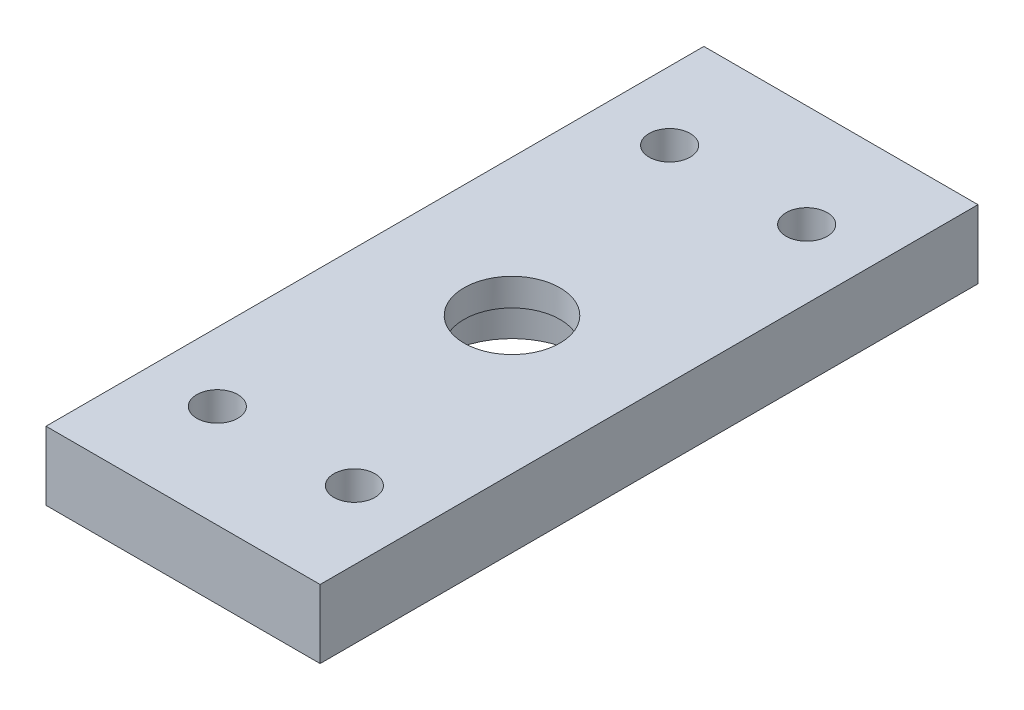
ISO-10303-21;
HEADER;
FILE_DESCRIPTION(('STEP AP214'),'2;1');
FILE_NAME('part.step','',(''),(''),'','','');
FILE_SCHEMA(('AUTOMOTIVE_DESIGN { 1 0 10303 214 1 1 1 1 }'));
ENDSEC;
DATA;
#1=APPLICATION_CONTEXT('core data for automotive mechanical design processes');
#2=APPLICATION_PROTOCOL_DEFINITION('international standard','automotive_design',2000,#1);
#3=PRODUCT_CONTEXT('',#1,'mechanical');
#4=PRODUCT('Part','Part','',(#3));
#5=PRODUCT_RELATED_PRODUCT_CATEGORY('part','',(#4));
#6=PRODUCT_DEFINITION_FORMATION('','',#4);
#7=PRODUCT_DEFINITION_CONTEXT('part definition',#1,'design');
#8=PRODUCT_DEFINITION('design','',#6,#7);
#9=PRODUCT_DEFINITION_SHAPE('','',#8);
#10=(LENGTH_UNIT() NAMED_UNIT(*) SI_UNIT(.MILLI.,.METRE.));
#11=(NAMED_UNIT(*) PLANE_ANGLE_UNIT() SI_UNIT($,.RADIAN.));
#12=(NAMED_UNIT(*) SI_UNIT($,.STERADIAN.) SOLID_ANGLE_UNIT());
#13=UNCERTAINTY_MEASURE_WITH_UNIT(LENGTH_MEASURE(1.E-05),#10,'distance_accuracy_value','');
#14=(GEOMETRIC_REPRESENTATION_CONTEXT(3) GLOBAL_UNCERTAINTY_ASSIGNED_CONTEXT((#13)) GLOBAL_UNIT_ASSIGNED_CONTEXT((#10,
#11,#12)) REPRESENTATION_CONTEXT('',''));
#15=CARTESIAN_POINT('',(0.,0.,0.));
#16=DIRECTION('',(0.,0.,1.));
#17=DIRECTION('',(1.,0.,0.));
#18=AXIS2_PLACEMENT_3D('',#15,#16,#17);
#19=CARTESIAN_POINT('',(0.,0.,0.));
#20=DIRECTION('',(0.,1.,0.));
#21=DIRECTION('',(0.,0.,1.));
#22=AXIS2_PLACEMENT_3D('',#19,#20,#21);
#23=CYLINDRICAL_SURFACE('',#22,3.5);
#24=CARTESIAN_POINT('',(0.,5.,0.));
#25=DIRECTION('',(0.,1.,0.));
#26=DIRECTION('',(0.,0.,1.));
#27=AXIS2_PLACEMENT_3D('',#24,#25,#26);
#28=CIRCLE('',#27,3.5);
#29=CARTESIAN_POINT('',(0.,5.,3.5));
#30=VERTEX_POINT('',#29);
#31=EDGE_CURVE('E105',#30,#30,#28,.T.);
#32=ORIENTED_EDGE('',*,*,#31,.T.);
#33=EDGE_LOOP('',(#32));
#34=FACE_BOUND('',#33,.T.);
#35=CARTESIAN_POINT('',(0.,3.,0.));
#36=DIRECTION('',(0.,-1.,0.));
#37=DIRECTION('',(0.,0.,-1.));
#38=AXIS2_PLACEMENT_3D('',#35,#36,#37);
#39=CIRCLE('',#38,3.5);
#40=CARTESIAN_POINT('',(0.,3.,-3.5));
#41=VERTEX_POINT('',#40);
#42=EDGE_CURVE('E40',#41,#41,#39,.F.);
#43=ORIENTED_EDGE('',*,*,#42,.F.);
#44=EDGE_LOOP('',(#43));
#45=FACE_BOUND('',#44,.T.);
#46=ADVANCED_FACE('F36',(#34,#45),#23,.F.);
#47=CARTESIAN_POINT('',(9.99999999999999,5.,-24.));
#48=DIRECTION('',(-1.,0.,0.));
#49=DIRECTION('',(0.,0.,1.));
#50=AXIS2_PLACEMENT_3D('',#47,#48,#49);
#51=PLANE('',#50);
#52=DIRECTION('',(0.,0.,-1.));
#53=VECTOR('',#52,1.);
#54=CARTESIAN_POINT('',(9.99999999999999,0.,-24.));
#55=LINE('',#54,#53);
#56=CARTESIAN_POINT('',(10.,0.,24.));
#57=VERTEX_POINT('',#56);
#58=CARTESIAN_POINT('',(9.99999999999999,0.,-24.));
#59=VERTEX_POINT('',#58);
#60=EDGE_CURVE('E102',#57,#59,#55,.T.);
#61=ORIENTED_EDGE('',*,*,#60,.T.);
#62=DIRECTION('',(0.,-1.,0.));
#63=VECTOR('',#62,1.);
#64=CARTESIAN_POINT('',(9.99999999999999,5.,-24.));
#65=LINE('',#64,#63);
#66=CARTESIAN_POINT('',(9.99999999999999,5.,-24.));
#67=VERTEX_POINT('',#66);
#68=EDGE_CURVE('E11',#67,#59,#65,.T.);
#69=ORIENTED_EDGE('',*,*,#68,.F.);
#70=DIRECTION('',(0.,0.,-1.));
#71=VECTOR('',#70,1.);
#72=CARTESIAN_POINT('',(9.99999999999999,5.,-24.));
#73=LINE('',#72,#71);
#74=CARTESIAN_POINT('',(10.,5.,24.));
#75=VERTEX_POINT('',#74);
#76=EDGE_CURVE('E89',#75,#67,#73,.T.);
#77=ORIENTED_EDGE('',*,*,#76,.F.);
#78=DIRECTION('',(0.,-1.,0.));
#79=VECTOR('',#78,1.);
#80=CARTESIAN_POINT('',(10.,5.,24.));
#81=LINE('',#80,#79);
#82=EDGE_CURVE('E98',#75,#57,#81,.T.);
#83=ORIENTED_EDGE('',*,*,#82,.T.);
#84=EDGE_LOOP('',(#61,#69,#77,#83));
#85=FACE_BOUND('',#84,.T.);
#86=ADVANCED_FACE('F38',(#85),#51,.F.);
#87=CARTESIAN_POINT('',(-10.,5.,-24.));
#88=DIRECTION('',(0.,0.,1.));
#89=DIRECTION('',(1.,0.,0.));
#90=AXIS2_PLACEMENT_3D('',#87,#88,#89);
#91=PLANE('',#90);
#92=DIRECTION('',(-1.,0.,0.));
#93=VECTOR('',#92,1.);
#94=CARTESIAN_POINT('',(-10.,0.,-24.));
#95=LINE('',#94,#93);
#96=CARTESIAN_POINT('',(-10.,0.,-24.));
#97=VERTEX_POINT('',#96);
#98=EDGE_CURVE('E93',#59,#97,#95,.T.);
#99=ORIENTED_EDGE('',*,*,#98,.T.);
#100=DIRECTION('',(0.,-1.,0.));
#101=VECTOR('',#100,1.);
#102=CARTESIAN_POINT('',(-10.,5.,-24.));
#103=LINE('',#102,#101);
#104=CARTESIAN_POINT('',(-10.,5.,-24.));
#105=VERTEX_POINT('',#104);
#106=EDGE_CURVE('E46',#105,#97,#103,.T.);
#107=ORIENTED_EDGE('',*,*,#106,.F.);
#108=DIRECTION('',(-1.,0.,0.));
#109=VECTOR('',#108,1.);
#110=CARTESIAN_POINT('',(-10.,5.,-24.));
#111=LINE('',#110,#109);
#112=EDGE_CURVE('E84',#67,#105,#111,.T.);
#113=ORIENTED_EDGE('',*,*,#112,.F.);
#114=ORIENTED_EDGE('',*,*,#68,.T.);
#115=EDGE_LOOP('',(#99,#107,#113,#114));
#116=FACE_BOUND('',#115,.T.);
#117=ADVANCED_FACE('F92',(#116),#91,.F.);
#118=CARTESIAN_POINT('',(-10.,5.,-24.));
#119=DIRECTION('',(1.,0.,0.));
#120=DIRECTION('',(0.,0.,-1.));
#121=AXIS2_PLACEMENT_3D('',#118,#119,#120);
#122=PLANE('',#121);
#123=DIRECTION('',(0.,0.,1.));
#124=VECTOR('',#123,1.);
#125=CARTESIAN_POINT('',(-10.,0.,-24.));
#126=LINE('',#125,#124);
#127=CARTESIAN_POINT('',(-10.,0.,24.));
#128=VERTEX_POINT('',#127);
#129=EDGE_CURVE('E71',#97,#128,#126,.T.);
#130=ORIENTED_EDGE('',*,*,#129,.T.);
#131=DIRECTION('',(0.,-1.,0.));
#132=VECTOR('',#131,1.);
#133=CARTESIAN_POINT('',(-10.,5.,24.));
#134=LINE('',#133,#132);
#135=CARTESIAN_POINT('',(-10.,5.,24.));
#136=VERTEX_POINT('',#135);
#137=EDGE_CURVE('E94',#136,#128,#134,.T.);
#138=ORIENTED_EDGE('',*,*,#137,.F.);
#139=DIRECTION('',(0.,0.,1.));
#140=VECTOR('',#139,1.);
#141=CARTESIAN_POINT('',(-10.,5.,-24.));
#142=LINE('',#141,#140);
#143=EDGE_CURVE('E87',#105,#136,#142,.T.);
#144=ORIENTED_EDGE('',*,*,#143,.F.);
#145=ORIENTED_EDGE('',*,*,#106,.T.);
#146=EDGE_LOOP('',(#130,#138,#144,#145));
#147=FACE_BOUND('',#146,.T.);
#148=ADVANCED_FACE('F96',(#147),#122,.F.);
#149=CARTESIAN_POINT('',(-10.,5.,24.));
#150=DIRECTION('',(0.,0.,-1.));
#151=DIRECTION('',(-1.,0.,0.));
#152=AXIS2_PLACEMENT_3D('',#149,#150,#151);
#153=PLANE('',#152);
#154=DIRECTION('',(1.,0.,0.));
#155=VECTOR('',#154,1.);
#156=CARTESIAN_POINT('',(-10.,0.,24.));
#157=LINE('',#156,#155);
#158=EDGE_CURVE('E77',#128,#57,#157,.T.);
#159=ORIENTED_EDGE('',*,*,#158,.T.);
#160=ORIENTED_EDGE('',*,*,#82,.F.);
#161=DIRECTION('',(1.,0.,0.));
#162=VECTOR('',#161,1.);
#163=CARTESIAN_POINT('',(-10.,5.,24.));
#164=LINE('',#163,#162);
#165=EDGE_CURVE('E54',#136,#75,#164,.T.);
#166=ORIENTED_EDGE('',*,*,#165,.F.);
#167=ORIENTED_EDGE('',*,*,#137,.T.);
#168=EDGE_LOOP('',(#159,#160,#166,#167));
#169=FACE_BOUND('',#168,.T.);
#170=ADVANCED_FACE('F110',(#169),#153,.F.);
#171=CARTESIAN_POINT('',(0.,5.,0.));
#172=DIRECTION('',(0.,1.,0.));
#173=DIRECTION('',(0.,0.,1.));
#174=AXIS2_PLACEMENT_3D('',#171,#172,#173);
#175=PLANE('',#174);
#176=CARTESIAN_POINT('',(5.,5.,16.5));
#177=DIRECTION('',(0.,-1.,0.));
#178=DIRECTION('',(0.,0.,-1.));
#179=AXIS2_PLACEMENT_3D('',#176,#177,#178);
#180=CIRCLE('',#179,1.5);
#181=CARTESIAN_POINT('',(5.,5.,15.));
#182=VERTEX_POINT('',#181);
#183=EDGE_CURVE('E134',#182,#182,#180,.T.);
#184=ORIENTED_EDGE('',*,*,#183,.T.);
#185=EDGE_LOOP('',(#184));
#186=FACE_BOUND('',#185,.T.);
#187=CARTESIAN_POINT('',(-5.,5.,16.5));
#188=DIRECTION('',(0.,-1.,0.));
#189=DIRECTION('',(0.,0.,-1.));
#190=AXIS2_PLACEMENT_3D('',#187,#188,#189);
#191=CIRCLE('',#190,1.5);
#192=CARTESIAN_POINT('',(-5.,5.,15.));
#193=VERTEX_POINT('',#192);
#194=EDGE_CURVE('E140',#193,#193,#191,.T.);
#195=ORIENTED_EDGE('',*,*,#194,.T.);
#196=EDGE_LOOP('',(#195));
#197=FACE_BOUND('',#196,.T.);
#198=CARTESIAN_POINT('',(-5.,5.,-16.5));
#199=DIRECTION('',(0.,-1.,0.));
#200=DIRECTION('',(0.,0.,-1.));
#201=AXIS2_PLACEMENT_3D('',#198,#199,#200);
#202=CIRCLE('',#201,1.50000000000001);
#203=CARTESIAN_POINT('',(-5.,5.,-18.));
#204=VERTEX_POINT('',#203);
#205=EDGE_CURVE('E128',#204,#204,#202,.T.);
#206=ORIENTED_EDGE('',*,*,#205,.T.);
#207=EDGE_LOOP('',(#206));
#208=FACE_BOUND('',#207,.T.);
#209=CARTESIAN_POINT('',(5.,5.,-16.5));
#210=DIRECTION('',(0.,-1.,0.));
#211=DIRECTION('',(0.,0.,-1.));
#212=AXIS2_PLACEMENT_3D('',#209,#210,#211);
#213=CIRCLE('',#212,1.5);
#214=CARTESIAN_POINT('',(5.,5.,-18.));
#215=VERTEX_POINT('',#214);
#216=EDGE_CURVE('E122',#215,#215,#213,.T.);
#217=ORIENTED_EDGE('',*,*,#216,.T.);
#218=EDGE_LOOP('',(#217));
#219=FACE_BOUND('',#218,.T.);
#220=ORIENTED_EDGE('',*,*,#31,.F.);
#221=EDGE_LOOP('',(#220));
#222=FACE_BOUND('',#221,.T.);
#223=ORIENTED_EDGE('',*,*,#76,.T.);
#224=ORIENTED_EDGE('',*,*,#112,.T.);
#225=ORIENTED_EDGE('',*,*,#143,.T.);
#226=ORIENTED_EDGE('',*,*,#165,.T.);
#227=EDGE_LOOP('',(#223,#224,#225,#226));
#228=FACE_BOUND('',#227,.T.);
#229=ADVANCED_FACE('F85',(#186,#197,#208,#219,#222,#228),#175,.T.);
#230=CARTESIAN_POINT('',(0.,0.,0.));
#231=DIRECTION('',(0.,1.,0.));
#232=DIRECTION('',(0.,0.,1.));
#233=AXIS2_PLACEMENT_3D('',#230,#231,#232);
#234=PLANE('',#233);
#235=CARTESIAN_POINT('',(5.,0.,16.5));
#236=DIRECTION('',(0.,-1.,0.));
#237=DIRECTION('',(0.,0.,-1.));
#238=AXIS2_PLACEMENT_3D('',#235,#236,#237);
#239=CIRCLE('',#238,1.5);
#240=CARTESIAN_POINT('',(5.,0.,15.));
#241=VERTEX_POINT('',#240);
#242=EDGE_CURVE('E131',#241,#241,#239,.T.);
#243=ORIENTED_EDGE('',*,*,#242,.F.);
#244=EDGE_LOOP('',(#243));
#245=FACE_BOUND('',#244,.T.);
#246=CARTESIAN_POINT('',(-5.,0.,16.5));
#247=DIRECTION('',(0.,-1.,0.));
#248=DIRECTION('',(0.,0.,-1.));
#249=AXIS2_PLACEMENT_3D('',#246,#247,#248);
#250=CIRCLE('',#249,1.5);
#251=CARTESIAN_POINT('',(-5.,0.,15.));
#252=VERTEX_POINT('',#251);
#253=EDGE_CURVE('E137',#252,#252,#250,.T.);
#254=ORIENTED_EDGE('',*,*,#253,.F.);
#255=EDGE_LOOP('',(#254));
#256=FACE_BOUND('',#255,.T.);
#257=CARTESIAN_POINT('',(-5.,0.,-16.5));
#258=DIRECTION('',(0.,-1.,0.));
#259=DIRECTION('',(0.,0.,-1.));
#260=AXIS2_PLACEMENT_3D('',#257,#258,#259);
#261=CIRCLE('',#260,1.50000000000001);
#262=CARTESIAN_POINT('',(-5.,0.,-18.));
#263=VERTEX_POINT('',#262);
#264=EDGE_CURVE('E143',#263,#263,#261,.T.);
#265=ORIENTED_EDGE('',*,*,#264,.F.);
#266=EDGE_LOOP('',(#265));
#267=FACE_BOUND('',#266,.T.);
#268=CARTESIAN_POINT('',(5.,0.,-16.5));
#269=DIRECTION('',(0.,-1.,0.));
#270=DIRECTION('',(0.,0.,-1.));
#271=AXIS2_PLACEMENT_3D('',#268,#269,#270);
#272=CIRCLE('',#271,1.5);
#273=CARTESIAN_POINT('',(5.,0.,-18.));
#274=VERTEX_POINT('',#273);
#275=EDGE_CURVE('E125',#274,#274,#272,.T.);
#276=ORIENTED_EDGE('',*,*,#275,.F.);
#277=EDGE_LOOP('',(#276));
#278=FACE_BOUND('',#277,.T.);
#279=CARTESIAN_POINT('',(0.,0.,0.));
#280=DIRECTION('',(0.,-1.,0.));
#281=DIRECTION('',(0.,0.,-1.));
#282=AXIS2_PLACEMENT_3D('',#279,#280,#281);
#283=CIRCLE('',#282,5.);
#284=CARTESIAN_POINT('',(0.,0.,-5.));
#285=VERTEX_POINT('',#284);
#286=EDGE_CURVE('E118',#285,#285,#283,.T.);
#287=ORIENTED_EDGE('',*,*,#286,.F.);
#288=EDGE_LOOP('',(#287));
#289=FACE_BOUND('',#288,.T.);
#290=ORIENTED_EDGE('',*,*,#60,.F.);
#291=ORIENTED_EDGE('',*,*,#158,.F.);
#292=ORIENTED_EDGE('',*,*,#129,.F.);
#293=ORIENTED_EDGE('',*,*,#98,.F.);
#294=EDGE_LOOP('',(#290,#291,#292,#293));
#295=FACE_BOUND('',#294,.T.);
#296=ADVANCED_FACE('F113',(#245,#256,#267,#278,#289,#295),#234,.F.);
#297=CARTESIAN_POINT('',(0.,3.,0.));
#298=DIRECTION('',(0.,-1.,0.));
#299=DIRECTION('',(0.,0.,-1.));
#300=AXIS2_PLACEMENT_3D('',#297,#298,#299);
#301=PLANE('',#300);
#302=CARTESIAN_POINT('',(0.,3.,0.));
#303=DIRECTION('',(0.,-1.,0.));
#304=DIRECTION('',(0.,0.,-1.));
#305=AXIS2_PLACEMENT_3D('',#302,#303,#304);
#306=CIRCLE('',#305,5.);
#307=CARTESIAN_POINT('',(0.,3.,-5.));
#308=VERTEX_POINT('',#307);
#309=EDGE_CURVE('E121',#308,#308,#306,.T.);
#310=ORIENTED_EDGE('',*,*,#309,.T.);
#311=EDGE_LOOP('',(#310));
#312=FACE_BOUND('',#311,.T.);
#313=ORIENTED_EDGE('',*,*,#42,.T.);
#314=EDGE_LOOP('',(#313));
#315=FACE_BOUND('',#314,.T.);
#316=ADVANCED_FACE('F161',(#312,#315),#301,.T.);
#317=CARTESIAN_POINT('',(0.,3.,0.));
#318=DIRECTION('',(0.,-1.,0.));
#319=DIRECTION('',(0.,0.,-1.));
#320=AXIS2_PLACEMENT_3D('',#317,#318,#319);
#321=CYLINDRICAL_SURFACE('',#320,5.);
#322=ORIENTED_EDGE('',*,*,#309,.F.);
#323=EDGE_LOOP('',(#322));
#324=FACE_BOUND('',#323,.T.);
#325=ORIENTED_EDGE('',*,*,#286,.T.);
#326=EDGE_LOOP('',(#325));
#327=FACE_BOUND('',#326,.T.);
#328=ADVANCED_FACE('F168',(#324,#327),#321,.F.);
#329=CARTESIAN_POINT('',(5.,5.,-16.5));
#330=DIRECTION('',(0.,-1.,0.));
#331=DIRECTION('',(0.,0.,-1.));
#332=AXIS2_PLACEMENT_3D('',#329,#330,#331);
#333=CYLINDRICAL_SURFACE('',#332,1.5);
#334=ORIENTED_EDGE('',*,*,#216,.F.);
#335=EDGE_LOOP('',(#334));
#336=FACE_BOUND('',#335,.T.);
#337=ORIENTED_EDGE('',*,*,#275,.T.);
#338=EDGE_LOOP('',(#337));
#339=FACE_BOUND('',#338,.T.);
#340=ADVANCED_FACE('F155',(#336,#339),#333,.F.);
#341=CARTESIAN_POINT('',(-5.,5.,-16.5));
#342=DIRECTION('',(0.,-1.,0.));
#343=DIRECTION('',(0.,0.,-1.));
#344=AXIS2_PLACEMENT_3D('',#341,#342,#343);
#345=CYLINDRICAL_SURFACE('',#344,1.50000000000001);
#346=ORIENTED_EDGE('',*,*,#205,.F.);
#347=EDGE_LOOP('',(#346));
#348=FACE_BOUND('',#347,.T.);
#349=ORIENTED_EDGE('',*,*,#264,.T.);
#350=EDGE_LOOP('',(#349));
#351=FACE_BOUND('',#350,.T.);
#352=ADVANCED_FACE('F151',(#348,#351),#345,.F.);
#353=CARTESIAN_POINT('',(-5.,5.,16.5));
#354=DIRECTION('',(0.,-1.,0.));
#355=DIRECTION('',(0.,0.,-1.));
#356=AXIS2_PLACEMENT_3D('',#353,#354,#355);
#357=CYLINDRICAL_SURFACE('',#356,1.5);
#358=ORIENTED_EDGE('',*,*,#194,.F.);
#359=EDGE_LOOP('',(#358));
#360=FACE_BOUND('',#359,.T.);
#361=ORIENTED_EDGE('',*,*,#253,.T.);
#362=EDGE_LOOP('',(#361));
#363=FACE_BOUND('',#362,.T.);
#364=ADVANCED_FACE('F154',(#360,#363),#357,.F.);
#365=CARTESIAN_POINT('',(5.,5.,16.5));
#366=DIRECTION('',(0.,-1.,0.));
#367=DIRECTION('',(0.,0.,-1.));
#368=AXIS2_PLACEMENT_3D('',#365,#366,#367);
#369=CYLINDRICAL_SURFACE('',#368,1.5);
#370=ORIENTED_EDGE('',*,*,#183,.F.);
#371=EDGE_LOOP('',(#370));
#372=FACE_BOUND('',#371,.T.);
#373=ORIENTED_EDGE('',*,*,#242,.T.);
#374=EDGE_LOOP('',(#373));
#375=FACE_BOUND('',#374,.T.);
#376=ADVANCED_FACE('F246',(#372,#375),#369,.F.);
#377=CLOSED_SHELL('',(#46,#86,#117,#148,#170,#229,#296,#316,#328,#340,#352,#364,#376));
#378=MANIFOLD_SOLID_BREP('B2',#377);
#379=ADVANCED_BREP_SHAPE_REPRESENTATION('',(#18,#378),#14);
#380=SHAPE_DEFINITION_REPRESENTATION(#9,#379);
ENDSEC;
END-ISO-10303-21;
